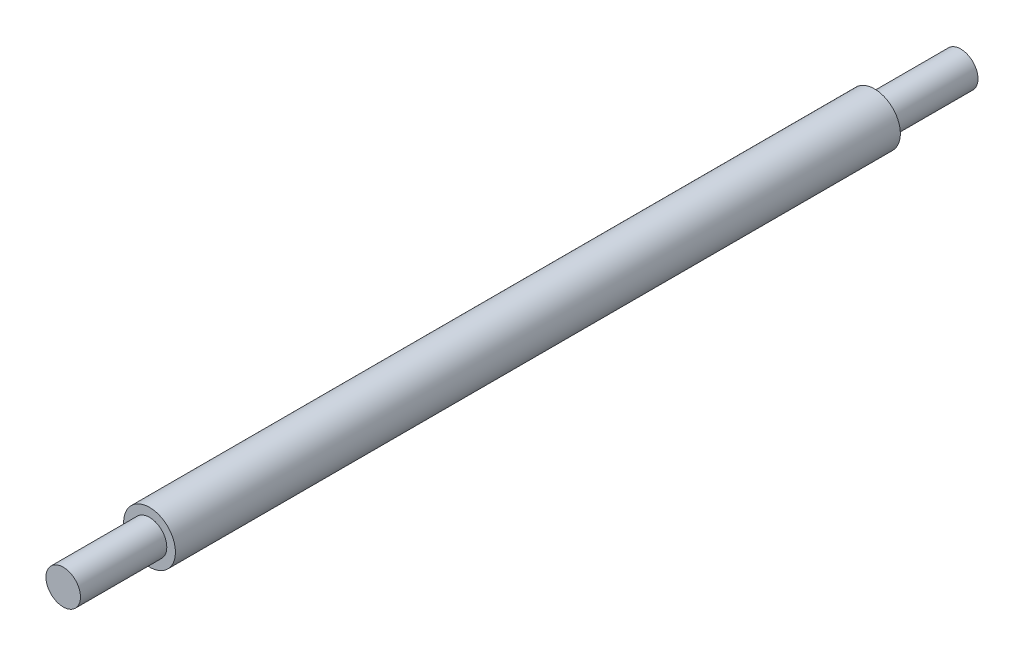
ISO-10303-21;
HEADER;
FILE_DESCRIPTION(('STEP AP214'),'2;1');
FILE_NAME('part.step','',(''),(''),'','','');
FILE_SCHEMA(('AUTOMOTIVE_DESIGN { 1 0 10303 214 1 1 1 1 }'));
ENDSEC;
DATA;
#1=APPLICATION_CONTEXT('core data for automotive mechanical design processes');
#2=APPLICATION_PROTOCOL_DEFINITION('international standard','automotive_design',2000,#1);
#3=PRODUCT_CONTEXT('',#1,'mechanical');
#4=PRODUCT('Part','Part','',(#3));
#5=PRODUCT_RELATED_PRODUCT_CATEGORY('part','',(#4));
#6=PRODUCT_DEFINITION_FORMATION('','',#4);
#7=PRODUCT_DEFINITION_CONTEXT('part definition',#1,'design');
#8=PRODUCT_DEFINITION('design','',#6,#7);
#9=PRODUCT_DEFINITION_SHAPE('','',#8);
#10=(LENGTH_UNIT() NAMED_UNIT(*) SI_UNIT(.MILLI.,.METRE.));
#11=(NAMED_UNIT(*) PLANE_ANGLE_UNIT() SI_UNIT($,.RADIAN.));
#12=(NAMED_UNIT(*) SI_UNIT($,.STERADIAN.) SOLID_ANGLE_UNIT());
#13=UNCERTAINTY_MEASURE_WITH_UNIT(LENGTH_MEASURE(1.E-05),#10,'distance_accuracy_value','');
#14=(GEOMETRIC_REPRESENTATION_CONTEXT(3) GLOBAL_UNCERTAINTY_ASSIGNED_CONTEXT((#13)) GLOBAL_UNIT_ASSIGNED_CONTEXT((#10,
#11,#12)) REPRESENTATION_CONTEXT('',''));
#15=CARTESIAN_POINT('',(0.,0.,0.));
#16=DIRECTION('',(0.,0.,1.));
#17=DIRECTION('',(1.,0.,0.));
#18=AXIS2_PLACEMENT_3D('',#15,#16,#17);
#19=CARTESIAN_POINT('',(0.,0.,42.));
#20=DIRECTION('',(0.,0.,-1.));
#21=DIRECTION('',(-1.,0.,0.));
#22=AXIS2_PLACEMENT_3D('',#19,#20,#21);
#23=CYLINDRICAL_SURFACE('',#22,3.);
#24=CARTESIAN_POINT('',(0.,0.,42.));
#25=DIRECTION('',(0.,0.,1.));
#26=DIRECTION('',(1.,0.,0.));
#27=AXIS2_PLACEMENT_3D('',#24,#25,#26);
#28=CIRCLE('',#27,3.);
#29=CARTESIAN_POINT('',(-3.,0.,42.));
#30=VERTEX_POINT('',#29);
#31=EDGE_CURVE('E10',#30,#30,#28,.T.);
#32=CARTESIAN_POINT('',(0.,0.,-42.));
#33=DIRECTION('',(0.,0.,1.));
#34=DIRECTION('',(1.,0.,0.));
#35=AXIS2_PLACEMENT_3D('',#32,#33,#34);
#36=CIRCLE('',#35,3.);
#37=CARTESIAN_POINT('',(-3.,0.,-42.));
#38=VERTEX_POINT('',#37);
#39=EDGE_CURVE('E42',#38,#38,#36,.T.);
#40=CARTESIAN_POINT('',(-3.,0.,42.));
#41=CARTESIAN_POINT('',(-3.,0.,41.125));
#42=CARTESIAN_POINT('',(-3.,0.,40.25));
#43=CARTESIAN_POINT('',(-3.,0.,38.5));
#44=CARTESIAN_POINT('',(-3.,0.,37.625));
#45=CARTESIAN_POINT('',(-3.,0.,35.875));
#46=CARTESIAN_POINT('',(-3.,0.,35.));
#47=CARTESIAN_POINT('',(-3.,0.,33.25));
#48=CARTESIAN_POINT('',(-3.,0.,32.375));
#49=CARTESIAN_POINT('',(-3.,0.,30.625));
#50=CARTESIAN_POINT('',(-3.,0.,29.75));
#51=CARTESIAN_POINT('',(-3.,0.,28.));
#52=CARTESIAN_POINT('',(-3.,0.,27.125));
#53=CARTESIAN_POINT('',(-3.,0.,25.375));
#54=CARTESIAN_POINT('',(-3.,0.,24.5));
#55=CARTESIAN_POINT('',(-3.,0.,22.75));
#56=CARTESIAN_POINT('',(-3.,0.,21.875));
#57=CARTESIAN_POINT('',(-3.,0.,20.125));
#58=CARTESIAN_POINT('',(-3.,0.,19.25));
#59=CARTESIAN_POINT('',(-3.,0.,17.5));
#60=CARTESIAN_POINT('',(-3.,0.,16.625));
#61=CARTESIAN_POINT('',(-3.,0.,14.875));
#62=CARTESIAN_POINT('',(-3.,0.,14.));
#63=CARTESIAN_POINT('',(-3.,0.,12.25));
#64=CARTESIAN_POINT('',(-3.,0.,11.375));
#65=CARTESIAN_POINT('',(-3.,0.,9.62499999999999));
#66=CARTESIAN_POINT('',(-3.,0.,8.74999999999999));
#67=CARTESIAN_POINT('',(-3.,0.,6.99999999999999));
#68=CARTESIAN_POINT('',(-3.,0.,6.125));
#69=CARTESIAN_POINT('',(-3.,0.,4.375));
#70=CARTESIAN_POINT('',(-3.,0.,3.5));
#71=CARTESIAN_POINT('',(-3.,0.,1.74999999999999));
#72=CARTESIAN_POINT('',(-3.,0.,0.874999999999994));
#73=CARTESIAN_POINT('',(-3.,0.,-0.875000000000008));
#74=CARTESIAN_POINT('',(-3.,0.,-1.75000000000001));
#75=CARTESIAN_POINT('',(-3.,0.,-3.50000000000001));
#76=CARTESIAN_POINT('',(-3.,0.,-4.37500000000001));
#77=CARTESIAN_POINT('',(-3.,0.,-6.12500000000001));
#78=CARTESIAN_POINT('',(-3.,0.,-7.00000000000001));
#79=CARTESIAN_POINT('',(-3.,0.,-8.75000000000001));
#80=CARTESIAN_POINT('',(-3.,0.,-9.62500000000001));
#81=CARTESIAN_POINT('',(-3.,0.,-11.375));
#82=CARTESIAN_POINT('',(-3.,0.,-12.25));
#83=CARTESIAN_POINT('',(-3.,0.,-14.));
#84=CARTESIAN_POINT('',(-3.,0.,-14.875));
#85=CARTESIAN_POINT('',(-3.,0.,-16.625));
#86=CARTESIAN_POINT('',(-3.,0.,-17.5));
#87=CARTESIAN_POINT('',(-3.,0.,-19.25));
#88=CARTESIAN_POINT('',(-3.,0.,-20.125));
#89=CARTESIAN_POINT('',(-3.,0.,-21.875));
#90=CARTESIAN_POINT('',(-3.,0.,-22.75));
#91=CARTESIAN_POINT('',(-3.,0.,-24.5));
#92=CARTESIAN_POINT('',(-3.,0.,-25.375));
#93=CARTESIAN_POINT('',(-3.,0.,-27.125));
#94=CARTESIAN_POINT('',(-3.,0.,-28.));
#95=CARTESIAN_POINT('',(-3.,0.,-29.75));
#96=CARTESIAN_POINT('',(-3.,0.,-30.625));
#97=CARTESIAN_POINT('',(-3.,0.,-32.375));
#98=CARTESIAN_POINT('',(-3.,0.,-33.25));
#99=CARTESIAN_POINT('',(-3.,0.,-35.));
#100=CARTESIAN_POINT('',(-3.,0.,-35.875));
#101=CARTESIAN_POINT('',(-3.,0.,-37.625));
#102=CARTESIAN_POINT('',(-3.,0.,-38.5));
#103=CARTESIAN_POINT('',(-3.,0.,-40.25));
#104=CARTESIAN_POINT('',(-3.,0.,-41.125));
#105=CARTESIAN_POINT('',(-3.,0.,-42.));
#106=B_SPLINE_CURVE_WITH_KNOTS('',3,(#40,#41,#42,#43,#44,#45,#46,#47,#48,#49,#50,#51,#52,#53,
#54,#55,#56,#57,#58,#59,#60,#61,#62,#63,#64,#65,#66,#67,#68,#69,#70,#71,#72,#73,#74,#75,#76,#77,
#78,#79,#80,#81,#82,#83,#84,#85,#86,#87,#88,#89,#90,#91,#92,#93,#94,#95,#96,#97,#98,#99,#100,
#101,#102,#103,#104,#105),.UNSPECIFIED.,.F.,.F.,(4,2,2,2,2,2,2,2,2,2,2,2,2,2,2,2,2,2,2,2,2,2,2,
2,2,2,2,2,2,2,2,2,4),(0.,2.625,5.25,7.87499999999999,10.5,13.125,15.75,18.375,21.,23.625,26.25,
28.875,31.5,34.125,36.75,39.375,42.,44.625,47.25,49.875,52.5,55.125,57.75,60.375,63.,65.625,
68.25,70.875,73.5,76.125,78.75,81.375,84.),.UNSPECIFIED.);
#107=EDGE_CURVE('BSEAM39',#30,#38,#106,.T.);
#108=ORIENTED_EDGE('',*,*,#31,.F.);
#109=ORIENTED_EDGE('',*,*,#39,.T.);
#110=ORIENTED_EDGE('',*,*,#107,.T.);
#111=ORIENTED_EDGE('',*,*,#107,.F.);
#112=EDGE_LOOP('',(#108,#110,#109,#111));
#113=FACE_BOUND('',#112,.T.);
#114=ADVANCED_FACE('F39',(#113),#23,.T.);
#115=CARTESIAN_POINT('',(0.,0.,42.));
#116=DIRECTION('',(0.,0.,1.));
#117=DIRECTION('',(1.,0.,0.));
#118=AXIS2_PLACEMENT_3D('',#115,#116,#117);
#119=PLANE('',#118);
#120=CARTESIAN_POINT('',(0.,0.,42.));
#121=DIRECTION('',(0.,0.,1.));
#122=DIRECTION('',(1.,0.,0.));
#123=AXIS2_PLACEMENT_3D('',#120,#121,#122);
#124=CIRCLE('',#123,2.);
#125=CARTESIAN_POINT('',(2.,0.,42.));
#126=VERTEX_POINT('',#125);
#127=EDGE_CURVE('E51',#126,#126,#124,.T.);
#128=ORIENTED_EDGE('',*,*,#127,.F.);
#129=EDGE_LOOP('',(#128));
#130=FACE_BOUND('',#129,.T.);
#131=ORIENTED_EDGE('',*,*,#31,.T.);
#132=EDGE_LOOP('',(#131));
#133=FACE_BOUND('',#132,.T.);
#134=ADVANCED_FACE('F75',(#130,#133),#119,.T.);
#135=CARTESIAN_POINT('',(0.,0.,-42.));
#136=DIRECTION('',(0.,0.,1.));
#137=DIRECTION('',(1.,0.,0.));
#138=AXIS2_PLACEMENT_3D('',#135,#136,#137);
#139=PLANE('',#138);
#140=CARTESIAN_POINT('',(0.,0.,-42.));
#141=DIRECTION('',(0.,0.,1.));
#142=DIRECTION('',(1.,0.,0.));
#143=AXIS2_PLACEMENT_3D('',#140,#141,#142);
#144=CIRCLE('',#143,2.);
#145=CARTESIAN_POINT('',(2.,0.,-42.));
#146=VERTEX_POINT('',#145);
#147=EDGE_CURVE('E57',#146,#146,#144,.T.);
#148=ORIENTED_EDGE('',*,*,#147,.T.);
#149=EDGE_LOOP('',(#148));
#150=FACE_BOUND('',#149,.T.);
#151=ORIENTED_EDGE('',*,*,#39,.F.);
#152=EDGE_LOOP('',(#151));
#153=FACE_BOUND('',#152,.T.);
#154=ADVANCED_FACE('F80',(#150,#153),#139,.F.);
#155=CARTESIAN_POINT('',(0.,0.,52.));
#156=DIRECTION('',(0.,0.,-1.));
#157=DIRECTION('',(-1.,0.,0.));
#158=AXIS2_PLACEMENT_3D('',#155,#156,#157);
#159=CYLINDRICAL_SURFACE('',#158,2.);
#160=CARTESIAN_POINT('',(0.,0.,52.));
#161=DIRECTION('',(0.,0.,1.));
#162=DIRECTION('',(1.,0.,0.));
#163=AXIS2_PLACEMENT_3D('',#160,#161,#162);
#164=CIRCLE('',#163,2.);
#165=CARTESIAN_POINT('',(2.,0.,52.));
#166=VERTEX_POINT('',#165);
#167=EDGE_CURVE('E49',#166,#166,#164,.T.);
#168=ORIENTED_EDGE('',*,*,#167,.F.);
#169=EDGE_LOOP('',(#168));
#170=FACE_BOUND('',#169,.T.);
#171=ORIENTED_EDGE('',*,*,#127,.T.);
#172=EDGE_LOOP('',(#171));
#173=FACE_BOUND('',#172,.T.);
#174=ADVANCED_FACE('F87',(#170,#173),#159,.T.);
#175=CARTESIAN_POINT('',(0.,0.,52.));
#176=DIRECTION('',(0.,0.,1.));
#177=DIRECTION('',(1.,0.,0.));
#178=AXIS2_PLACEMENT_3D('',#175,#176,#177);
#179=PLANE('',#178);
#180=ORIENTED_EDGE('',*,*,#167,.T.);
#181=EDGE_LOOP('',(#180));
#182=FACE_BOUND('',#181,.T.);
#183=ADVANCED_FACE('F72',(#182),#179,.T.);
#184=CARTESIAN_POINT('',(0.,0.,-52.));
#185=DIRECTION('',(0.,0.,1.));
#186=DIRECTION('',(1.,0.,0.));
#187=AXIS2_PLACEMENT_3D('',#184,#185,#186);
#188=CYLINDRICAL_SURFACE('',#187,2.);
#189=CARTESIAN_POINT('',(0.,0.,-52.));
#190=DIRECTION('',(0.,0.,1.));
#191=DIRECTION('',(1.,0.,0.));
#192=AXIS2_PLACEMENT_3D('',#189,#190,#191);
#193=CIRCLE('',#192,2.);
#194=CARTESIAN_POINT('',(2.,0.,-52.));
#195=VERTEX_POINT('',#194);
#196=EDGE_CURVE('E54',#195,#195,#193,.T.);
#197=ORIENTED_EDGE('',*,*,#196,.T.);
#198=EDGE_LOOP('',(#197));
#199=FACE_BOUND('',#198,.T.);
#200=ORIENTED_EDGE('',*,*,#147,.F.);
#201=EDGE_LOOP('',(#200));
#202=FACE_BOUND('',#201,.T.);
#203=ADVANCED_FACE('F63',(#199,#202),#188,.T.);
#204=CARTESIAN_POINT('',(0.,0.,-52.));
#205=DIRECTION('',(0.,0.,-1.));
#206=DIRECTION('',(1.,0.,0.));
#207=AXIS2_PLACEMENT_3D('',#204,#205,#206);
#208=PLANE('',#207);
#209=ORIENTED_EDGE('',*,*,#196,.F.);
#210=EDGE_LOOP('',(#209));
#211=FACE_BOUND('',#210,.T.);
#212=ADVANCED_FACE('F66',(#211),#208,.T.);
#213=CLOSED_SHELL('',(#114,#134,#154,#174,#183,#203,#212));
#214=MANIFOLD_SOLID_BREP('B2',#213);
#215=ADVANCED_BREP_SHAPE_REPRESENTATION('',(#18,#214),#14);
#216=SHAPE_DEFINITION_REPRESENTATION(#9,#215);
ENDSEC;
END-ISO-10303-21;
